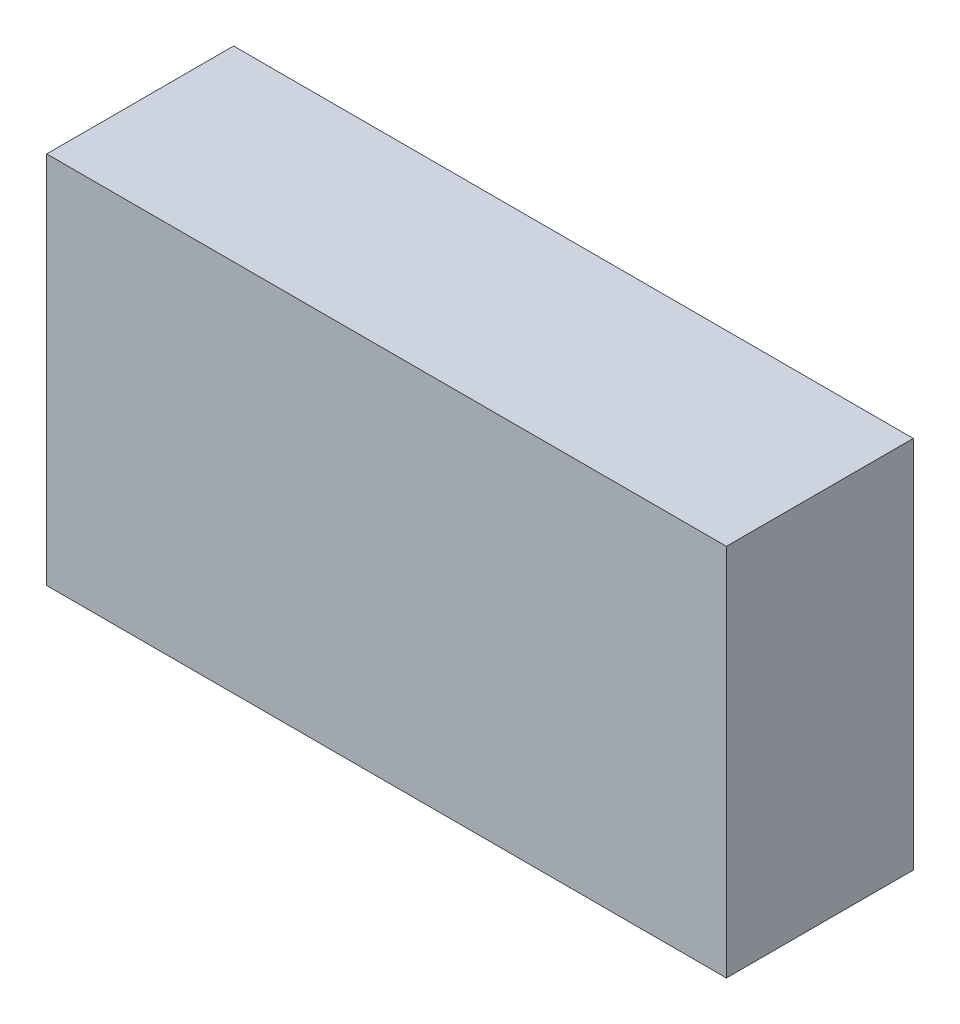
ISO-10303-21;
HEADER;
FILE_DESCRIPTION(('STEP AP214'),'2;1');
FILE_NAME('part.step','',(''),(''),'','','');
FILE_SCHEMA(('AUTOMOTIVE_DESIGN { 1 0 10303 214 1 1 1 1 }'));
ENDSEC;
DATA;
#1=APPLICATION_CONTEXT('core data for automotive mechanical design processes');
#2=APPLICATION_PROTOCOL_DEFINITION('international standard','automotive_design',2000,#1);
#3=PRODUCT_CONTEXT('',#1,'mechanical');
#4=PRODUCT('Part','Part','',(#3));
#5=PRODUCT_RELATED_PRODUCT_CATEGORY('part','',(#4));
#6=PRODUCT_DEFINITION_FORMATION('','',#4);
#7=PRODUCT_DEFINITION_CONTEXT('part definition',#1,'design');
#8=PRODUCT_DEFINITION('design','',#6,#7);
#9=PRODUCT_DEFINITION_SHAPE('','',#8);
#10=(LENGTH_UNIT() NAMED_UNIT(*) SI_UNIT(.MILLI.,.METRE.));
#11=(NAMED_UNIT(*) PLANE_ANGLE_UNIT() SI_UNIT($,.RADIAN.));
#12=(NAMED_UNIT(*) SI_UNIT($,.STERADIAN.) SOLID_ANGLE_UNIT());
#13=UNCERTAINTY_MEASURE_WITH_UNIT(LENGTH_MEASURE(1.E-05),#10,'distance_accuracy_value','');
#14=(GEOMETRIC_REPRESENTATION_CONTEXT(3) GLOBAL_UNCERTAINTY_ASSIGNED_CONTEXT((#13)) GLOBAL_UNIT_ASSIGNED_CONTEXT((#10,
#11,#12)) REPRESENTATION_CONTEXT('',''));
#15=CARTESIAN_POINT('',(0.,0.,0.));
#16=DIRECTION('',(0.,0.,1.));
#17=DIRECTION('',(1.,0.,0.));
#18=AXIS2_PLACEMENT_3D('',#15,#16,#17);
#19=CARTESIAN_POINT('',(-8.,28.,11.));
#20=DIRECTION('',(1.,0.,0.));
#21=DIRECTION('',(0.,0.,-1.));
#22=AXIS2_PLACEMENT_3D('',#19,#20,#21);
#23=PLANE('',#22);
#24=DIRECTION('',(0.,-1.,0.));
#25=VECTOR('',#24,1.);
#26=CARTESIAN_POINT('',(-8.,28.,0.));
#27=LINE('',#26,#25);
#28=CARTESIAN_POINT('',(-8.,28.,0.));
#29=VERTEX_POINT('',#28);
#30=CARTESIAN_POINT('',(-8.,6.,0.));
#31=VERTEX_POINT('',#30);
#32=EDGE_CURVE('E104',#29,#31,#27,.T.);
#33=ORIENTED_EDGE('',*,*,#32,.T.);
#34=DIRECTION('',(0.,0.,-1.));
#35=VECTOR('',#34,1.);
#36=CARTESIAN_POINT('',(-8.,6.,11.));
#37=LINE('',#36,#35);
#38=CARTESIAN_POINT('',(-8.,6.,11.));
#39=VERTEX_POINT('',#38);
#40=EDGE_CURVE('E11',#39,#31,#37,.T.);
#41=ORIENTED_EDGE('',*,*,#40,.F.);
#42=DIRECTION('',(0.,-1.,0.));
#43=VECTOR('',#42,1.);
#44=CARTESIAN_POINT('',(-8.,28.,11.));
#45=LINE('',#44,#43);
#46=CARTESIAN_POINT('',(-8.,28.,11.));
#47=VERTEX_POINT('',#46);
#48=EDGE_CURVE('E92',#47,#39,#45,.T.);
#49=ORIENTED_EDGE('',*,*,#48,.F.);
#50=DIRECTION('',(0.,0.,-1.));
#51=VECTOR('',#50,1.);
#52=CARTESIAN_POINT('',(-8.,28.,11.));
#53=LINE('',#52,#51);
#54=EDGE_CURVE('E100',#47,#29,#53,.T.);
#55=ORIENTED_EDGE('',*,*,#54,.T.);
#56=EDGE_LOOP('',(#33,#41,#49,#55));
#57=FACE_BOUND('',#56,.T.);
#58=ADVANCED_FACE('F41',(#57),#23,.F.);
#59=CARTESIAN_POINT('',(-8.,6.,11.));
#60=DIRECTION('',(0.,1.,0.));
#61=DIRECTION('',(0.,0.,1.));
#62=AXIS2_PLACEMENT_3D('',#59,#60,#61);
#63=PLANE('',#62);
#64=DIRECTION('',(1.,0.,0.));
#65=VECTOR('',#64,1.);
#66=CARTESIAN_POINT('',(-8.,6.,0.));
#67=LINE('',#66,#65);
#68=CARTESIAN_POINT('',(32.,6.,0.));
#69=VERTEX_POINT('',#68);
#70=EDGE_CURVE('E96',#31,#69,#67,.T.);
#71=ORIENTED_EDGE('',*,*,#70,.T.);
#72=DIRECTION('',(0.,0.,-1.));
#73=VECTOR('',#72,1.);
#74=CARTESIAN_POINT('',(32.,6.,11.));
#75=LINE('',#74,#73);
#76=CARTESIAN_POINT('',(32.,6.,11.));
#77=VERTEX_POINT('',#76);
#78=EDGE_CURVE('E49',#77,#69,#75,.T.);
#79=ORIENTED_EDGE('',*,*,#78,.F.);
#80=DIRECTION('',(1.,0.,0.));
#81=VECTOR('',#80,1.);
#82=CARTESIAN_POINT('',(-8.,6.,11.));
#83=LINE('',#82,#81);
#84=EDGE_CURVE('E87',#39,#77,#83,.T.);
#85=ORIENTED_EDGE('',*,*,#84,.F.);
#86=ORIENTED_EDGE('',*,*,#40,.T.);
#87=EDGE_LOOP('',(#71,#79,#85,#86));
#88=FACE_BOUND('',#87,.T.);
#89=ADVANCED_FACE('F95',(#88),#63,.F.);
#90=CARTESIAN_POINT('',(32.,6.,11.));
#91=DIRECTION('',(-1.,0.,0.));
#92=DIRECTION('',(0.,0.,1.));
#93=AXIS2_PLACEMENT_3D('',#90,#91,#92);
#94=PLANE('',#93);
#95=DIRECTION('',(0.,1.,0.));
#96=VECTOR('',#95,1.);
#97=CARTESIAN_POINT('',(32.,6.,0.));
#98=LINE('',#97,#96);
#99=CARTESIAN_POINT('',(32.,28.,0.));
#100=VERTEX_POINT('',#99);
#101=EDGE_CURVE('E74',#69,#100,#98,.T.);
#102=ORIENTED_EDGE('',*,*,#101,.T.);
#103=DIRECTION('',(0.,0.,-1.));
#104=VECTOR('',#103,1.);
#105=CARTESIAN_POINT('',(32.,28.,11.));
#106=LINE('',#105,#104);
#107=CARTESIAN_POINT('',(32.,28.,11.));
#108=VERTEX_POINT('',#107);
#109=EDGE_CURVE('E97',#108,#100,#106,.T.);
#110=ORIENTED_EDGE('',*,*,#109,.F.);
#111=DIRECTION('',(0.,1.,0.));
#112=VECTOR('',#111,1.);
#113=CARTESIAN_POINT('',(32.,6.,11.));
#114=LINE('',#113,#112);
#115=EDGE_CURVE('E90',#77,#108,#114,.T.);
#116=ORIENTED_EDGE('',*,*,#115,.F.);
#117=ORIENTED_EDGE('',*,*,#78,.T.);
#118=EDGE_LOOP('',(#102,#110,#116,#117));
#119=FACE_BOUND('',#118,.T.);
#120=ADVANCED_FACE('F98',(#119),#94,.F.);
#121=CARTESIAN_POINT('',(32.,28.,11.));
#122=DIRECTION('',(0.,-1.,0.));
#123=DIRECTION('',(0.,0.,-1.));
#124=AXIS2_PLACEMENT_3D('',#121,#122,#123);
#125=PLANE('',#124);
#126=DIRECTION('',(-1.,0.,0.));
#127=VECTOR('',#126,1.);
#128=CARTESIAN_POINT('',(32.,28.,0.));
#129=LINE('',#128,#127);
#130=EDGE_CURVE('E80',#100,#29,#129,.T.);
#131=ORIENTED_EDGE('',*,*,#130,.T.);
#132=ORIENTED_EDGE('',*,*,#54,.F.);
#133=DIRECTION('',(-1.,0.,0.));
#134=VECTOR('',#133,1.);
#135=CARTESIAN_POINT('',(32.,28.,11.));
#136=LINE('',#135,#134);
#137=EDGE_CURVE('E57',#108,#47,#136,.T.);
#138=ORIENTED_EDGE('',*,*,#137,.F.);
#139=ORIENTED_EDGE('',*,*,#109,.T.);
#140=EDGE_LOOP('',(#131,#132,#138,#139));
#141=FACE_BOUND('',#140,.T.);
#142=ADVANCED_FACE('F111',(#141),#125,.F.);
#143=CARTESIAN_POINT('',(0.,0.,11.));
#144=DIRECTION('',(0.,0.,1.));
#145=DIRECTION('',(1.,0.,0.));
#146=AXIS2_PLACEMENT_3D('',#143,#144,#145);
#147=PLANE('',#146);
#148=ORIENTED_EDGE('',*,*,#48,.T.);
#149=ORIENTED_EDGE('',*,*,#84,.T.);
#150=ORIENTED_EDGE('',*,*,#115,.T.);
#151=ORIENTED_EDGE('',*,*,#137,.T.);
#152=EDGE_LOOP('',(#148,#149,#150,#151));
#153=FACE_BOUND('',#152,.T.);
#154=ADVANCED_FACE('F88',(#153),#147,.T.);
#155=CARTESIAN_POINT('',(0.,0.,0.));
#156=DIRECTION('',(0.,0.,1.));
#157=DIRECTION('',(1.,0.,0.));
#158=AXIS2_PLACEMENT_3D('',#155,#156,#157);
#159=PLANE('',#158);
#160=ORIENTED_EDGE('',*,*,#32,.F.);
#161=ORIENTED_EDGE('',*,*,#130,.F.);
#162=ORIENTED_EDGE('',*,*,#101,.F.);
#163=ORIENTED_EDGE('',*,*,#70,.F.);
#164=EDGE_LOOP('',(#160,#161,#162,#163));
#165=FACE_BOUND('',#164,.T.);
#166=ADVANCED_FACE('F114',(#165),#159,.F.);
#167=CLOSED_SHELL('',(#58,#89,#120,#142,#154,#166));
#168=MANIFOLD_SOLID_BREP('B2',#167);
#169=ADVANCED_BREP_SHAPE_REPRESENTATION('',(#18,#168),#14);
#170=SHAPE_DEFINITION_REPRESENTATION(#9,#169);
ENDSEC;
END-ISO-10303-21;
